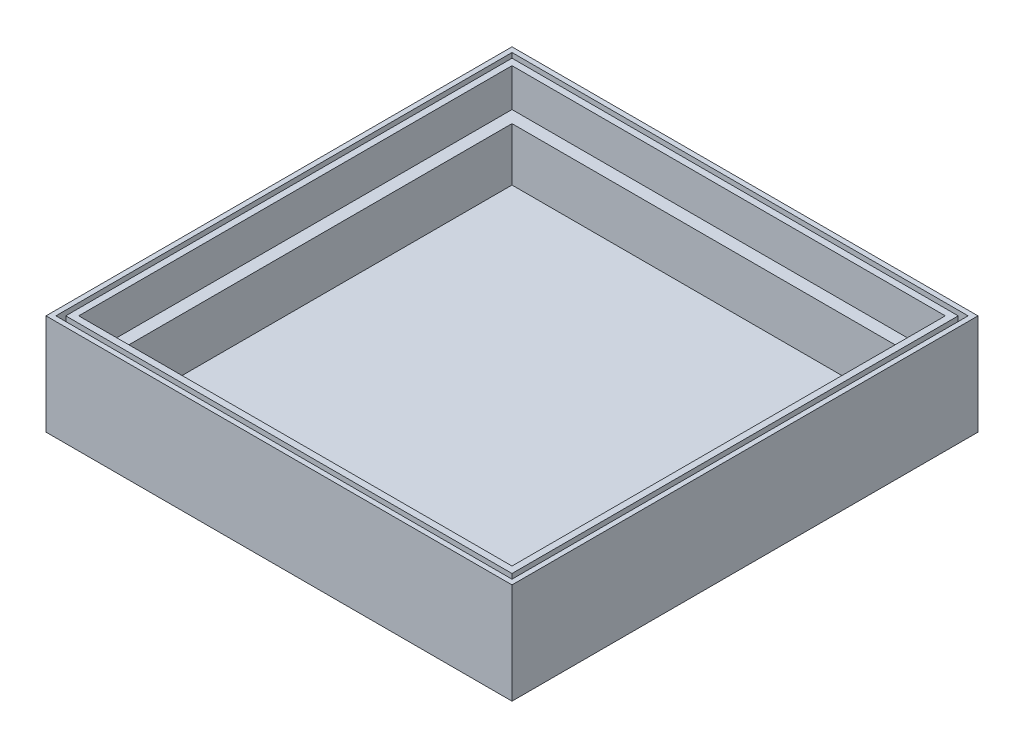
ISO-10303-21;
HEADER;
FILE_DESCRIPTION(('STEP AP214'),'2;1');
FILE_NAME('part.step','',(''),(''),'','','');
FILE_SCHEMA(('AUTOMOTIVE_DESIGN { 1 0 10303 214 1 1 1 1 }'));
ENDSEC;
DATA;
#1=APPLICATION_CONTEXT('core data for automotive mechanical design processes');
#2=APPLICATION_PROTOCOL_DEFINITION('international standard','automotive_design',2000,#1);
#3=PRODUCT_CONTEXT('',#1,'mechanical');
#4=PRODUCT('Part','Part','',(#3));
#5=PRODUCT_RELATED_PRODUCT_CATEGORY('part','',(#4));
#6=PRODUCT_DEFINITION_FORMATION('','',#4);
#7=PRODUCT_DEFINITION_CONTEXT('part definition',#1,'design');
#8=PRODUCT_DEFINITION('design','',#6,#7);
#9=PRODUCT_DEFINITION_SHAPE('','',#8);
#10=(LENGTH_UNIT() NAMED_UNIT(*) SI_UNIT(.MILLI.,.METRE.));
#11=(NAMED_UNIT(*) PLANE_ANGLE_UNIT() SI_UNIT($,.RADIAN.));
#12=(NAMED_UNIT(*) SI_UNIT($,.STERADIAN.) SOLID_ANGLE_UNIT());
#13=UNCERTAINTY_MEASURE_WITH_UNIT(LENGTH_MEASURE(1.E-05),#10,'distance_accuracy_value','');
#14=(GEOMETRIC_REPRESENTATION_CONTEXT(3) GLOBAL_UNCERTAINTY_ASSIGNED_CONTEXT((#13)) GLOBAL_UNIT_ASSIGNED_CONTEXT((#10,
#11,#12)) REPRESENTATION_CONTEXT('',''));
#15=CARTESIAN_POINT('',(0.,0.,0.));
#16=DIRECTION('',(0.,0.,1.));
#17=DIRECTION('',(1.,0.,0.));
#18=AXIS2_PLACEMENT_3D('',#15,#16,#17);
#19=CARTESIAN_POINT('',(0.,67.31,0.));
#20=DIRECTION('',(0.,-1.,0.));
#21=DIRECTION('',(0.,0.,-1.));
#22=AXIS2_PLACEMENT_3D('',#19,#20,#21);
#23=PLANE('',#22);
#24=DIRECTION('',(1.,0.,0.));
#25=VECTOR('',#24,1.);
#26=CARTESIAN_POINT('',(-144.78,67.31,144.78));
#27=LINE('',#26,#25);
#28=CARTESIAN_POINT('',(-144.78,67.31,144.78));
#29=VERTEX_POINT('',#28);
#30=CARTESIAN_POINT('',(144.78,67.31,144.78));
#31=VERTEX_POINT('',#30);
#32=EDGE_CURVE('E279',#29,#31,#27,.T.);
#33=ORIENTED_EDGE('',*,*,#32,.F.);
#34=DIRECTION('',(0.,0.,1.));
#35=VECTOR('',#34,1.);
#36=CARTESIAN_POINT('',(-144.78,67.31,-144.78));
#37=LINE('',#36,#35);
#38=CARTESIAN_POINT('',(-144.78,67.31,-144.78));
#39=VERTEX_POINT('',#38);
#40=EDGE_CURVE('E256',#39,#29,#37,.T.);
#41=ORIENTED_EDGE('',*,*,#40,.F.);
#42=DIRECTION('',(-1.,0.,0.));
#43=VECTOR('',#42,1.);
#44=CARTESIAN_POINT('',(-144.78,67.31,-144.78));
#45=LINE('',#44,#43);
#46=CARTESIAN_POINT('',(144.78,67.31,-144.78));
#47=VERTEX_POINT('',#46);
#48=EDGE_CURVE('E268',#47,#39,#45,.T.);
#49=ORIENTED_EDGE('',*,*,#48,.F.);
#50=DIRECTION('',(0.,0.,-1.));
#51=VECTOR('',#50,1.);
#52=CARTESIAN_POINT('',(144.78,67.31,-144.78));
#53=LINE('',#52,#51);
#54=EDGE_CURVE('E282',#31,#47,#53,.T.);
#55=ORIENTED_EDGE('',*,*,#54,.F.);
#56=EDGE_LOOP('',(#33,#41,#49,#55));
#57=FACE_BOUND('',#56,.T.);
#58=DIRECTION('',(0.,0.,1.));
#59=VECTOR('',#58,1.);
#60=CARTESIAN_POINT('',(-149.098,67.31,-149.098));
#61=LINE('',#60,#59);
#62=CARTESIAN_POINT('',(-149.098,67.31,-149.098));
#63=VERTEX_POINT('',#62);
#64=CARTESIAN_POINT('',(-149.098,67.31,149.098));
#65=VERTEX_POINT('',#64);
#66=EDGE_CURVE('E202',#63,#65,#61,.T.);
#67=ORIENTED_EDGE('',*,*,#66,.T.);
#68=DIRECTION('',(1.,0.,0.));
#69=VECTOR('',#68,1.);
#70=CARTESIAN_POINT('',(-149.098,67.31,149.098));
#71=LINE('',#70,#69);
#72=CARTESIAN_POINT('',(149.098,67.31,149.098));
#73=VERTEX_POINT('',#72);
#74=EDGE_CURVE('E175',#65,#73,#71,.T.);
#75=ORIENTED_EDGE('',*,*,#74,.T.);
#76=DIRECTION('',(0.,0.,-1.));
#77=VECTOR('',#76,1.);
#78=CARTESIAN_POINT('',(149.098,67.31,-149.098));
#79=LINE('',#78,#77);
#80=CARTESIAN_POINT('',(149.098,67.31,-149.098));
#81=VERTEX_POINT('',#80);
#82=EDGE_CURVE('E55',#73,#81,#79,.T.);
#83=ORIENTED_EDGE('',*,*,#82,.T.);
#84=DIRECTION('',(-1.,0.,0.));
#85=VECTOR('',#84,1.);
#86=CARTESIAN_POINT('',(-149.098,67.31,-149.098));
#87=LINE('',#86,#85);
#88=EDGE_CURVE('E195',#81,#63,#87,.T.);
#89=ORIENTED_EDGE('',*,*,#88,.T.);
#90=EDGE_LOOP('',(#67,#75,#83,#89));
#91=FACE_BOUND('',#90,.T.);
#92=ADVANCED_FACE('F32',(#57,#91),#23,.F.);
#93=CARTESIAN_POINT('',(-144.78,41.91,-144.78));
#94=DIRECTION('',(-1.,0.,0.));
#95=DIRECTION('',(0.,0.,1.));
#96=AXIS2_PLACEMENT_3D('',#93,#94,#95);
#97=PLANE('',#96);
#98=ORIENTED_EDGE('',*,*,#40,.T.);
#99=DIRECTION('',(0.,1.,0.));
#100=VECTOR('',#99,1.);
#101=CARTESIAN_POINT('',(-144.78,41.91,144.78));
#102=LINE('',#101,#100);
#103=CARTESIAN_POINT('',(-144.78,41.91,144.78));
#104=VERTEX_POINT('',#103);
#105=EDGE_CURVE('E277',#104,#29,#102,.T.);
#106=ORIENTED_EDGE('',*,*,#105,.F.);
#107=DIRECTION('',(0.,0.,1.));
#108=VECTOR('',#107,1.);
#109=CARTESIAN_POINT('',(-144.78,41.91,-144.78));
#110=LINE('',#109,#108);
#111=CARTESIAN_POINT('',(-144.78,41.91,-144.78));
#112=VERTEX_POINT('',#111);
#113=EDGE_CURVE('E264',#112,#104,#110,.T.);
#114=ORIENTED_EDGE('',*,*,#113,.F.);
#115=DIRECTION('',(0.,1.,0.));
#116=VECTOR('',#115,1.);
#117=CARTESIAN_POINT('',(-144.78,41.91,-144.78));
#118=LINE('',#117,#116);
#119=EDGE_CURVE('E287',#112,#39,#118,.T.);
#120=ORIENTED_EDGE('',*,*,#119,.T.);
#121=EDGE_LOOP('',(#98,#106,#114,#120));
#122=FACE_BOUND('',#121,.T.);
#123=ADVANCED_FACE('F361',(#122),#97,.F.);
#124=CARTESIAN_POINT('',(-144.78,41.91,-144.78));
#125=DIRECTION('',(0.,0.,-1.));
#126=DIRECTION('',(-1.,0.,0.));
#127=AXIS2_PLACEMENT_3D('',#124,#125,#126);
#128=PLANE('',#127);
#129=ORIENTED_EDGE('',*,*,#48,.T.);
#130=ORIENTED_EDGE('',*,*,#119,.F.);
#131=DIRECTION('',(-1.,0.,0.));
#132=VECTOR('',#131,1.);
#133=CARTESIAN_POINT('',(-144.78,41.91,-144.78));
#134=LINE('',#133,#132);
#135=CARTESIAN_POINT('',(144.78,41.91,-144.78));
#136=VERTEX_POINT('',#135);
#137=EDGE_CURVE('E274',#136,#112,#134,.T.);
#138=ORIENTED_EDGE('',*,*,#137,.F.);
#139=DIRECTION('',(0.,1.,0.));
#140=VECTOR('',#139,1.);
#141=CARTESIAN_POINT('',(144.78,41.91,-144.78));
#142=LINE('',#141,#140);
#143=EDGE_CURVE('E290',#136,#47,#142,.T.);
#144=ORIENTED_EDGE('',*,*,#143,.T.);
#145=EDGE_LOOP('',(#129,#130,#138,#144));
#146=FACE_BOUND('',#145,.T.);
#147=ADVANCED_FACE('F368',(#146),#128,.F.);
#148=CARTESIAN_POINT('',(144.78,41.91,-144.78));
#149=DIRECTION('',(1.,0.,0.));
#150=DIRECTION('',(0.,0.,-1.));
#151=AXIS2_PLACEMENT_3D('',#148,#149,#150);
#152=PLANE('',#151);
#153=ORIENTED_EDGE('',*,*,#54,.T.);
#154=ORIENTED_EDGE('',*,*,#143,.F.);
#155=DIRECTION('',(0.,0.,-1.));
#156=VECTOR('',#155,1.);
#157=CARTESIAN_POINT('',(144.78,41.91,-144.78));
#158=LINE('',#157,#156);
#159=CARTESIAN_POINT('',(144.78,41.91,144.78));
#160=VERTEX_POINT('',#159);
#161=EDGE_CURVE('E271',#160,#136,#158,.T.);
#162=ORIENTED_EDGE('',*,*,#161,.F.);
#163=DIRECTION('',(0.,1.,0.));
#164=VECTOR('',#163,1.);
#165=CARTESIAN_POINT('',(144.78,41.91,144.78));
#166=LINE('',#165,#164);
#167=EDGE_CURVE('E292',#160,#31,#166,.T.);
#168=ORIENTED_EDGE('',*,*,#167,.T.);
#169=EDGE_LOOP('',(#153,#154,#162,#168));
#170=FACE_BOUND('',#169,.T.);
#171=ADVANCED_FACE('F456',(#170),#152,.F.);
#172=CARTESIAN_POINT('',(-144.78,41.91,144.78));
#173=DIRECTION('',(0.,0.,1.));
#174=DIRECTION('',(1.,0.,0.));
#175=AXIS2_PLACEMENT_3D('',#172,#173,#174);
#176=PLANE('',#175);
#177=ORIENTED_EDGE('',*,*,#32,.T.);
#178=ORIENTED_EDGE('',*,*,#167,.F.);
#179=DIRECTION('',(1.,0.,0.));
#180=VECTOR('',#179,1.);
#181=CARTESIAN_POINT('',(-144.78,41.91,144.78));
#182=LINE('',#181,#180);
#183=EDGE_CURVE('E267',#104,#160,#182,.T.);
#184=ORIENTED_EDGE('',*,*,#183,.F.);
#185=ORIENTED_EDGE('',*,*,#105,.T.);
#186=EDGE_LOOP('',(#177,#178,#184,#185));
#187=FACE_BOUND('',#186,.T.);
#188=ADVANCED_FACE('F465',(#187),#176,.F.);
#189=CARTESIAN_POINT('',(0.,41.91,0.));
#190=DIRECTION('',(0.,1.,0.));
#191=DIRECTION('',(0.,0.,1.));
#192=AXIS2_PLACEMENT_3D('',#189,#190,#191);
#193=PLANE('',#192);
#194=DIRECTION('',(0.,0.,1.));
#195=VECTOR('',#194,1.);
#196=CARTESIAN_POINT('',(-136.652,41.91,0.));
#197=LINE('',#196,#195);
#198=CARTESIAN_POINT('',(-136.652,41.91,-136.652));
#199=VERTEX_POINT('',#198);
#200=CARTESIAN_POINT('',(-136.652,41.91,136.652));
#201=VERTEX_POINT('',#200);
#202=EDGE_CURVE('E11',#199,#201,#197,.T.);
#203=ORIENTED_EDGE('',*,*,#202,.F.);
#204=DIRECTION('',(-1.,0.,0.));
#205=VECTOR('',#204,1.);
#206=CARTESIAN_POINT('',(0.,41.91,-136.652));
#207=LINE('',#206,#205);
#208=CARTESIAN_POINT('',(136.652,41.91,-136.652));
#209=VERTEX_POINT('',#208);
#210=EDGE_CURVE('E40',#209,#199,#207,.T.);
#211=ORIENTED_EDGE('',*,*,#210,.F.);
#212=DIRECTION('',(0.,0.,-1.));
#213=VECTOR('',#212,1.);
#214=CARTESIAN_POINT('',(136.652,41.91,0.));
#215=LINE('',#214,#213);
#216=CARTESIAN_POINT('',(136.652,41.91,136.652));
#217=VERTEX_POINT('',#216);
#218=EDGE_CURVE('E327',#217,#209,#215,.T.);
#219=ORIENTED_EDGE('',*,*,#218,.F.);
#220=DIRECTION('',(1.,0.,0.));
#221=VECTOR('',#220,1.);
#222=CARTESIAN_POINT('',(0.,41.91,136.652));
#223=LINE('',#222,#221);
#224=EDGE_CURVE('E319',#201,#217,#223,.T.);
#225=ORIENTED_EDGE('',*,*,#224,.F.);
#226=EDGE_LOOP('',(#203,#211,#219,#225));
#227=FACE_BOUND('',#226,.T.);
#228=ORIENTED_EDGE('',*,*,#113,.T.);
#229=ORIENTED_EDGE('',*,*,#183,.T.);
#230=ORIENTED_EDGE('',*,*,#161,.T.);
#231=ORIENTED_EDGE('',*,*,#137,.T.);
#232=EDGE_LOOP('',(#228,#229,#230,#231));
#233=FACE_BOUND('',#232,.T.);
#234=ADVANCED_FACE('F339',(#227,#233),#193,.T.);
#235=CARTESIAN_POINT('',(-136.652,6.35,136.652));
#236=DIRECTION('',(-1.,0.,0.));
#237=DIRECTION('',(0.,0.,1.));
#238=AXIS2_PLACEMENT_3D('',#235,#236,#237);
#239=PLANE('',#238);
#240=ORIENTED_EDGE('',*,*,#202,.T.);
#241=DIRECTION('',(0.,1.,0.));
#242=VECTOR('',#241,1.);
#243=CARTESIAN_POINT('',(-136.652,6.35,136.652));
#244=LINE('',#243,#242);
#245=CARTESIAN_POINT('',(-136.652,6.35,136.652));
#246=VERTEX_POINT('',#245);
#247=EDGE_CURVE('E252',#246,#201,#244,.T.);
#248=ORIENTED_EDGE('',*,*,#247,.F.);
#249=DIRECTION('',(0.,0.,1.));
#250=VECTOR('',#249,1.);
#251=CARTESIAN_POINT('',(-136.652,6.35,136.652));
#252=LINE('',#251,#250);
#253=CARTESIAN_POINT('',(-136.652,6.35,-136.652));
#254=VERTEX_POINT('',#253);
#255=EDGE_CURVE('E235',#254,#246,#252,.T.);
#256=ORIENTED_EDGE('',*,*,#255,.F.);
#257=DIRECTION('',(0.,1.,0.));
#258=VECTOR('',#257,1.);
#259=CARTESIAN_POINT('',(-136.652,6.35,-136.652));
#260=LINE('',#259,#258);
#261=EDGE_CURVE('E253',#254,#199,#260,.T.);
#262=ORIENTED_EDGE('',*,*,#261,.T.);
#263=EDGE_LOOP('',(#240,#248,#256,#262));
#264=FACE_BOUND('',#263,.T.);
#265=ADVANCED_FACE('F337',(#264),#239,.F.);
#266=CARTESIAN_POINT('',(-136.652,6.35,-136.652));
#267=DIRECTION('',(0.,0.,-1.));
#268=DIRECTION('',(-1.,0.,0.));
#269=AXIS2_PLACEMENT_3D('',#266,#267,#268);
#270=PLANE('',#269);
#271=ORIENTED_EDGE('',*,*,#210,.T.);
#272=ORIENTED_EDGE('',*,*,#261,.F.);
#273=DIRECTION('',(-1.,0.,0.));
#274=VECTOR('',#273,1.);
#275=CARTESIAN_POINT('',(-136.652,6.35,-136.652));
#276=LINE('',#275,#274);
#277=CARTESIAN_POINT('',(136.652,6.35,-136.652));
#278=VERTEX_POINT('',#277);
#279=EDGE_CURVE('E249',#278,#254,#276,.T.);
#280=ORIENTED_EDGE('',*,*,#279,.F.);
#281=DIRECTION('',(0.,1.,0.));
#282=VECTOR('',#281,1.);
#283=CARTESIAN_POINT('',(136.652,6.35,-136.652));
#284=LINE('',#283,#282);
#285=EDGE_CURVE('E257',#278,#209,#284,.T.);
#286=ORIENTED_EDGE('',*,*,#285,.T.);
#287=EDGE_LOOP('',(#271,#272,#280,#286));
#288=FACE_BOUND('',#287,.T.);
#289=ADVANCED_FACE('F330',(#288),#270,.F.);
#290=CARTESIAN_POINT('',(136.652,6.35,136.652));
#291=DIRECTION('',(1.,0.,0.));
#292=DIRECTION('',(0.,0.,-1.));
#293=AXIS2_PLACEMENT_3D('',#290,#291,#292);
#294=PLANE('',#293);
#295=ORIENTED_EDGE('',*,*,#218,.T.);
#296=ORIENTED_EDGE('',*,*,#285,.F.);
#297=DIRECTION('',(0.,0.,-1.));
#298=VECTOR('',#297,1.);
#299=CARTESIAN_POINT('',(136.652,6.35,136.652));
#300=LINE('',#299,#298);
#301=CARTESIAN_POINT('',(136.652,6.35,136.652));
#302=VERTEX_POINT('',#301);
#303=EDGE_CURVE('E246',#302,#278,#300,.T.);
#304=ORIENTED_EDGE('',*,*,#303,.F.);
#305=DIRECTION('',(0.,1.,0.));
#306=VECTOR('',#305,1.);
#307=CARTESIAN_POINT('',(136.652,6.35,136.652));
#308=LINE('',#307,#306);
#309=EDGE_CURVE('E260',#302,#217,#308,.T.);
#310=ORIENTED_EDGE('',*,*,#309,.T.);
#311=EDGE_LOOP('',(#295,#296,#304,#310));
#312=FACE_BOUND('',#311,.T.);
#313=ADVANCED_FACE('F346',(#312),#294,.F.);
#314=CARTESIAN_POINT('',(-136.652,6.35,136.652));
#315=DIRECTION('',(0.,0.,1.));
#316=DIRECTION('',(1.,0.,0.));
#317=AXIS2_PLACEMENT_3D('',#314,#315,#316);
#318=PLANE('',#317);
#319=ORIENTED_EDGE('',*,*,#224,.T.);
#320=ORIENTED_EDGE('',*,*,#309,.F.);
#321=DIRECTION('',(1.,0.,0.));
#322=VECTOR('',#321,1.);
#323=CARTESIAN_POINT('',(-136.652,6.35,136.652));
#324=LINE('',#323,#322);
#325=EDGE_CURVE('E243',#246,#302,#324,.T.);
#326=ORIENTED_EDGE('',*,*,#325,.F.);
#327=ORIENTED_EDGE('',*,*,#247,.T.);
#328=EDGE_LOOP('',(#319,#320,#326,#327));
#329=FACE_BOUND('',#328,.T.);
#330=ADVANCED_FACE('F342',(#329),#318,.F.);
#331=CARTESIAN_POINT('',(0.,6.35,0.));
#332=DIRECTION('',(0.,-1.,0.));
#333=DIRECTION('',(0.,0.,-1.));
#334=AXIS2_PLACEMENT_3D('',#331,#332,#333);
#335=PLANE('',#334);
#336=ORIENTED_EDGE('',*,*,#255,.T.);
#337=ORIENTED_EDGE('',*,*,#325,.T.);
#338=ORIENTED_EDGE('',*,*,#303,.T.);
#339=ORIENTED_EDGE('',*,*,#279,.T.);
#340=EDGE_LOOP('',(#336,#337,#338,#339));
#341=FACE_BOUND('',#340,.T.);
#342=ADVANCED_FACE('F348',(#341),#335,.F.);
#343=CARTESIAN_POINT('',(-152.4,54.61,-152.4));
#344=DIRECTION('',(-1.,0.,0.));
#345=DIRECTION('',(0.,0.,1.));
#346=AXIS2_PLACEMENT_3D('',#343,#344,#345);
#347=PLANE('',#346);
#348=DIRECTION('',(0.,0.,1.));
#349=VECTOR('',#348,1.);
#350=CARTESIAN_POINT('',(-152.4,67.31,-152.4));
#351=LINE('',#350,#349);
#352=CARTESIAN_POINT('',(-152.4,67.31,-152.4));
#353=VERTEX_POINT('',#352);
#354=CARTESIAN_POINT('',(-152.4,67.31,152.4));
#355=VERTEX_POINT('',#354);
#356=EDGE_CURVE('E47',#353,#355,#351,.T.);
#357=ORIENTED_EDGE('',*,*,#356,.T.);
#358=DIRECTION('',(0.,1.,0.));
#359=VECTOR('',#358,1.);
#360=CARTESIAN_POINT('',(-152.4,54.61,152.4));
#361=LINE('',#360,#359);
#362=CARTESIAN_POINT('',(-152.4,54.61,152.4));
#363=VERTEX_POINT('',#362);
#364=EDGE_CURVE('E223',#363,#355,#361,.T.);
#365=ORIENTED_EDGE('',*,*,#364,.F.);
#366=DIRECTION('',(0.,0.,1.));
#367=VECTOR('',#366,1.);
#368=CARTESIAN_POINT('',(-152.4,54.61,-152.4));
#369=LINE('',#368,#367);
#370=CARTESIAN_POINT('',(-152.4,54.61,-152.4));
#371=VERTEX_POINT('',#370);
#372=EDGE_CURVE('E210',#371,#363,#369,.T.);
#373=ORIENTED_EDGE('',*,*,#372,.F.);
#374=DIRECTION('',(0.,1.,0.));
#375=VECTOR('',#374,1.);
#376=CARTESIAN_POINT('',(-152.4,54.61,-152.4));
#377=LINE('',#376,#375);
#378=EDGE_CURVE('E233',#371,#353,#377,.T.);
#379=ORIENTED_EDGE('',*,*,#378,.T.);
#380=EDGE_LOOP('',(#357,#365,#373,#379));
#381=FACE_BOUND('',#380,.T.);
#382=ADVANCED_FACE('F350',(#381),#347,.F.);
#383=CARTESIAN_POINT('',(-152.4,54.61,-152.4));
#384=DIRECTION('',(0.,0.,-1.));
#385=DIRECTION('',(-1.,0.,0.));
#386=AXIS2_PLACEMENT_3D('',#383,#384,#385);
#387=PLANE('',#386);
#388=DIRECTION('',(-1.,0.,0.));
#389=VECTOR('',#388,1.);
#390=CARTESIAN_POINT('',(-152.4,67.31,-152.4));
#391=LINE('',#390,#389);
#392=CARTESIAN_POINT('',(152.4,67.31,-152.4));
#393=VERTEX_POINT('',#392);
#394=EDGE_CURVE('E214',#393,#353,#391,.T.);
#395=ORIENTED_EDGE('',*,*,#394,.T.);
#396=ORIENTED_EDGE('',*,*,#378,.F.);
#397=DIRECTION('',(-1.,0.,0.));
#398=VECTOR('',#397,1.);
#399=CARTESIAN_POINT('',(-152.4,54.61,-152.4));
#400=LINE('',#399,#398);
#401=CARTESIAN_POINT('',(152.4,54.61,-152.4));
#402=VERTEX_POINT('',#401);
#403=EDGE_CURVE('E220',#402,#371,#400,.T.);
#404=ORIENTED_EDGE('',*,*,#403,.F.);
#405=DIRECTION('',(0.,1.,0.));
#406=VECTOR('',#405,1.);
#407=CARTESIAN_POINT('',(152.4,54.61,-152.4));
#408=LINE('',#407,#406);
#409=EDGE_CURVE('E236',#402,#393,#408,.T.);
#410=ORIENTED_EDGE('',*,*,#409,.T.);
#411=EDGE_LOOP('',(#395,#396,#404,#410));
#412=FACE_BOUND('',#411,.T.);
#413=ADVANCED_FACE('F356',(#412),#387,.F.);
#414=CARTESIAN_POINT('',(152.4,54.61,-152.4));
#415=DIRECTION('',(1.,0.,0.));
#416=DIRECTION('',(0.,0.,-1.));
#417=AXIS2_PLACEMENT_3D('',#414,#415,#416);
#418=PLANE('',#417);
#419=DIRECTION('',(0.,0.,-1.));
#420=VECTOR('',#419,1.);
#421=CARTESIAN_POINT('',(152.4,67.31,-152.4));
#422=LINE('',#421,#420);
#423=CARTESIAN_POINT('',(152.4,67.31,152.4));
#424=VERTEX_POINT('',#423);
#425=EDGE_CURVE('E228',#424,#393,#422,.T.);
#426=ORIENTED_EDGE('',*,*,#425,.T.);
#427=ORIENTED_EDGE('',*,*,#409,.F.);
#428=DIRECTION('',(0.,0.,-1.));
#429=VECTOR('',#428,1.);
#430=CARTESIAN_POINT('',(152.4,54.61,-152.4));
#431=LINE('',#430,#429);
#432=CARTESIAN_POINT('',(152.4,54.61,152.4));
#433=VERTEX_POINT('',#432);
#434=EDGE_CURVE('E217',#433,#402,#431,.T.);
#435=ORIENTED_EDGE('',*,*,#434,.F.);
#436=DIRECTION('',(0.,1.,0.));
#437=VECTOR('',#436,1.);
#438=CARTESIAN_POINT('',(152.4,54.61,152.4));
#439=LINE('',#438,#437);
#440=EDGE_CURVE('E238',#433,#424,#439,.T.);
#441=ORIENTED_EDGE('',*,*,#440,.T.);
#442=EDGE_LOOP('',(#426,#427,#435,#441));
#443=FACE_BOUND('',#442,.T.);
#444=ADVANCED_FACE('F527',(#443),#418,.F.);
#445=CARTESIAN_POINT('',(-152.4,54.61,152.4));
#446=DIRECTION('',(0.,0.,1.));
#447=DIRECTION('',(1.,0.,0.));
#448=AXIS2_PLACEMENT_3D('',#445,#446,#447);
#449=PLANE('',#448);
#450=DIRECTION('',(1.,0.,0.));
#451=VECTOR('',#450,1.);
#452=CARTESIAN_POINT('',(-152.4,67.31,152.4));
#453=LINE('',#452,#451);
#454=EDGE_CURVE('E225',#355,#424,#453,.T.);
#455=ORIENTED_EDGE('',*,*,#454,.T.);
#456=ORIENTED_EDGE('',*,*,#440,.F.);
#457=DIRECTION('',(1.,0.,0.));
#458=VECTOR('',#457,1.);
#459=CARTESIAN_POINT('',(-152.4,54.61,152.4));
#460=LINE('',#459,#458);
#461=EDGE_CURVE('E213',#363,#433,#460,.T.);
#462=ORIENTED_EDGE('',*,*,#461,.F.);
#463=ORIENTED_EDGE('',*,*,#364,.T.);
#464=EDGE_LOOP('',(#455,#456,#462,#463));
#465=FACE_BOUND('',#464,.T.);
#466=ADVANCED_FACE('F536',(#465),#449,.F.);
#467=CARTESIAN_POINT('',(0.,54.61,0.));
#468=DIRECTION('',(0.,1.,0.));
#469=DIRECTION('',(0.,0.,1.));
#470=AXIS2_PLACEMENT_3D('',#467,#468,#469);
#471=PLANE('',#470);
#472=DIRECTION('',(-1.,0.,0.));
#473=VECTOR('',#472,1.);
#474=CARTESIAN_POINT('',(-149.098,54.61,-149.098));
#475=LINE('',#474,#473);
#476=CARTESIAN_POINT('',(149.098,54.61,-149.098));
#477=VERTEX_POINT('',#476);
#478=CARTESIAN_POINT('',(-149.098,54.61,-149.098));
#479=VERTEX_POINT('',#478);
#480=EDGE_CURVE('E181',#477,#479,#475,.T.);
#481=ORIENTED_EDGE('',*,*,#480,.F.);
#482=DIRECTION('',(0.,0.,-1.));
#483=VECTOR('',#482,1.);
#484=CARTESIAN_POINT('',(149.098,54.61,-149.098));
#485=LINE('',#484,#483);
#486=CARTESIAN_POINT('',(149.098,54.61,149.098));
#487=VERTEX_POINT('',#486);
#488=EDGE_CURVE('E191',#487,#477,#485,.T.);
#489=ORIENTED_EDGE('',*,*,#488,.F.);
#490=DIRECTION('',(1.,0.,0.));
#491=VECTOR('',#490,1.);
#492=CARTESIAN_POINT('',(-149.098,54.61,149.098));
#493=LINE('',#492,#491);
#494=CARTESIAN_POINT('',(-149.098,54.61,149.098));
#495=VERTEX_POINT('',#494);
#496=EDGE_CURVE('E173',#495,#487,#493,.T.);
#497=ORIENTED_EDGE('',*,*,#496,.F.);
#498=DIRECTION('',(0.,0.,1.));
#499=VECTOR('',#498,1.);
#500=CARTESIAN_POINT('',(-149.098,54.61,-149.098));
#501=LINE('',#500,#499);
#502=EDGE_CURVE('E188',#479,#495,#501,.T.);
#503=ORIENTED_EDGE('',*,*,#502,.F.);
#504=EDGE_LOOP('',(#481,#489,#497,#503));
#505=FACE_BOUND('',#504,.T.);
#506=ORIENTED_EDGE('',*,*,#372,.T.);
#507=ORIENTED_EDGE('',*,*,#461,.T.);
#508=ORIENTED_EDGE('',*,*,#434,.T.);
#509=ORIENTED_EDGE('',*,*,#403,.T.);
#510=EDGE_LOOP('',(#506,#507,#508,#509));
#511=FACE_BOUND('',#510,.T.);
#512=ADVANCED_FACE('F186',(#505,#511),#471,.T.);
#513=CARTESIAN_POINT('',(-149.098,54.61,-149.098));
#514=DIRECTION('',(-1.,0.,0.));
#515=DIRECTION('',(0.,0.,1.));
#516=AXIS2_PLACEMENT_3D('',#513,#514,#515);
#517=PLANE('',#516);
#518=ORIENTED_EDGE('',*,*,#66,.F.);
#519=DIRECTION('',(0.,1.,0.));
#520=VECTOR('',#519,1.);
#521=CARTESIAN_POINT('',(-149.098,54.61,-149.098));
#522=LINE('',#521,#520);
#523=EDGE_CURVE('E194',#479,#63,#522,.T.);
#524=ORIENTED_EDGE('',*,*,#523,.F.);
#525=ORIENTED_EDGE('',*,*,#502,.T.);
#526=DIRECTION('',(0.,1.,0.));
#527=VECTOR('',#526,1.);
#528=CARTESIAN_POINT('',(-149.098,54.61,149.098));
#529=LINE('',#528,#527);
#530=EDGE_CURVE('E170',#495,#65,#529,.T.);
#531=ORIENTED_EDGE('',*,*,#530,.T.);
#532=EDGE_LOOP('',(#518,#524,#525,#531));
#533=FACE_BOUND('',#532,.T.);
#534=ADVANCED_FACE('F193',(#533),#517,.T.);
#535=CARTESIAN_POINT('',(-149.098,54.61,-149.098));
#536=DIRECTION('',(0.,0.,-1.));
#537=DIRECTION('',(-1.,0.,0.));
#538=AXIS2_PLACEMENT_3D('',#535,#536,#537);
#539=PLANE('',#538);
#540=ORIENTED_EDGE('',*,*,#88,.F.);
#541=DIRECTION('',(0.,1.,0.));
#542=VECTOR('',#541,1.);
#543=CARTESIAN_POINT('',(149.098,54.61,-149.098));
#544=LINE('',#543,#542);
#545=EDGE_CURVE('E207',#477,#81,#544,.T.);
#546=ORIENTED_EDGE('',*,*,#545,.F.);
#547=ORIENTED_EDGE('',*,*,#480,.T.);
#548=ORIENTED_EDGE('',*,*,#523,.T.);
#549=EDGE_LOOP('',(#540,#546,#547,#548));
#550=FACE_BOUND('',#549,.T.);
#551=ADVANCED_FACE('F560',(#550),#539,.T.);
#552=CARTESIAN_POINT('',(149.098,54.61,-149.098));
#553=DIRECTION('',(1.,0.,0.));
#554=DIRECTION('',(0.,0.,-1.));
#555=AXIS2_PLACEMENT_3D('',#552,#553,#554);
#556=PLANE('',#555);
#557=ORIENTED_EDGE('',*,*,#82,.F.);
#558=DIRECTION('',(0.,1.,0.));
#559=VECTOR('',#558,1.);
#560=CARTESIAN_POINT('',(149.098,54.61,149.098));
#561=LINE('',#560,#559);
#562=EDGE_CURVE('E180',#487,#73,#561,.T.);
#563=ORIENTED_EDGE('',*,*,#562,.F.);
#564=ORIENTED_EDGE('',*,*,#488,.T.);
#565=ORIENTED_EDGE('',*,*,#545,.T.);
#566=EDGE_LOOP('',(#557,#563,#564,#565));
#567=FACE_BOUND('',#566,.T.);
#568=ADVANCED_FACE('F406',(#567),#556,.T.);
#569=CARTESIAN_POINT('',(-149.098,54.61,149.098));
#570=DIRECTION('',(0.,0.,1.));
#571=DIRECTION('',(1.,0.,0.));
#572=AXIS2_PLACEMENT_3D('',#569,#570,#571);
#573=PLANE('',#572);
#574=ORIENTED_EDGE('',*,*,#74,.F.);
#575=ORIENTED_EDGE('',*,*,#530,.F.);
#576=ORIENTED_EDGE('',*,*,#496,.T.);
#577=ORIENTED_EDGE('',*,*,#562,.T.);
#578=EDGE_LOOP('',(#574,#575,#576,#577));
#579=FACE_BOUND('',#578,.T.);
#580=ADVANCED_FACE('F172',(#579),#573,.T.);
#581=CARTESIAN_POINT('',(0.,0.,0.));
#582=DIRECTION('',(0.,-1.,0.));
#583=DIRECTION('',(0.,0.,-1.));
#584=AXIS2_PLACEMENT_3D('',#581,#582,#583);
#585=PLANE('',#584);
#586=DIRECTION('',(0.,0.,-1.));
#587=VECTOR('',#586,1.);
#588=CARTESIAN_POINT('',(-155.702,0.,155.702));
#589=LINE('',#588,#587);
#590=CARTESIAN_POINT('',(-155.702,0.,155.702));
#591=VERTEX_POINT('',#590);
#592=CARTESIAN_POINT('',(-155.702,0.,-155.702));
#593=VERTEX_POINT('',#592);
#594=EDGE_CURVE('E289',#591,#593,#589,.T.);
#595=ORIENTED_EDGE('',*,*,#594,.T.);
#596=DIRECTION('',(1.,0.,0.));
#597=VECTOR('',#596,1.);
#598=CARTESIAN_POINT('',(-155.702,0.,-155.702));
#599=LINE('',#598,#597);
#600=CARTESIAN_POINT('',(155.702,0.,-155.702));
#601=VERTEX_POINT('',#600);
#602=EDGE_CURVE('E310',#593,#601,#599,.T.);
#603=ORIENTED_EDGE('',*,*,#602,.T.);
#604=DIRECTION('',(0.,0.,-1.));
#605=VECTOR('',#604,1.);
#606=CARTESIAN_POINT('',(155.702,0.,155.702));
#607=LINE('',#606,#605);
#608=CARTESIAN_POINT('',(155.702,0.,155.702));
#609=VERTEX_POINT('',#608);
#610=EDGE_CURVE('E313',#609,#601,#607,.T.);
#611=ORIENTED_EDGE('',*,*,#610,.F.);
#612=DIRECTION('',(1.,0.,0.));
#613=VECTOR('',#612,1.);
#614=CARTESIAN_POINT('',(-155.702,0.,155.702));
#615=LINE('',#614,#613);
#616=EDGE_CURVE('E300',#591,#609,#615,.T.);
#617=ORIENTED_EDGE('',*,*,#616,.F.);
#618=EDGE_LOOP('',(#595,#603,#611,#617));
#619=FACE_BOUND('',#618,.T.);
#620=ADVANCED_FACE('F400',(#619),#585,.T.);
#621=CARTESIAN_POINT('',(-155.702,67.31,-155.702));
#622=DIRECTION('',(0.,0.,-1.));
#623=DIRECTION('',(-1.,0.,0.));
#624=AXIS2_PLACEMENT_3D('',#621,#622,#623);
#625=PLANE('',#624);
#626=ORIENTED_EDGE('',*,*,#602,.F.);
#627=DIRECTION('',(0.,-1.,0.));
#628=VECTOR('',#627,1.);
#629=CARTESIAN_POINT('',(-155.702,67.31,-155.702));
#630=LINE('',#629,#628);
#631=CARTESIAN_POINT('',(-155.702,67.31,-155.702));
#632=VERTEX_POINT('',#631);
#633=EDGE_CURVE('E307',#632,#593,#630,.T.);
#634=ORIENTED_EDGE('',*,*,#633,.F.);
#635=DIRECTION('',(1.,0.,0.));
#636=VECTOR('',#635,1.);
#637=CARTESIAN_POINT('',(-155.702,67.31,-155.702));
#638=LINE('',#637,#636);
#639=CARTESIAN_POINT('',(155.702,67.31,-155.702));
#640=VERTEX_POINT('',#639);
#641=EDGE_CURVE('E299',#632,#640,#638,.T.);
#642=ORIENTED_EDGE('',*,*,#641,.T.);
#643=DIRECTION('',(0.,-1.,0.));
#644=VECTOR('',#643,1.);
#645=CARTESIAN_POINT('',(155.702,67.31,-155.702));
#646=LINE('',#645,#644);
#647=EDGE_CURVE('E323',#640,#601,#646,.T.);
#648=ORIENTED_EDGE('',*,*,#647,.T.);
#649=EDGE_LOOP('',(#626,#634,#642,#648));
#650=FACE_BOUND('',#649,.T.);
#651=ADVANCED_FACE('F398',(#650),#625,.T.);
#652=CARTESIAN_POINT('',(155.702,67.31,155.702));
#653=DIRECTION('',(-1.,0.,0.));
#654=DIRECTION('',(0.,0.,1.));
#655=AXIS2_PLACEMENT_3D('',#652,#653,#654);
#656=PLANE('',#655);
#657=ORIENTED_EDGE('',*,*,#610,.T.);
#658=ORIENTED_EDGE('',*,*,#647,.F.);
#659=DIRECTION('',(0.,0.,-1.));
#660=VECTOR('',#659,1.);
#661=CARTESIAN_POINT('',(155.702,67.31,155.702));
#662=LINE('',#661,#660);
#663=CARTESIAN_POINT('',(155.702,67.31,155.702));
#664=VERTEX_POINT('',#663);
#665=EDGE_CURVE('E303',#664,#640,#662,.T.);
#666=ORIENTED_EDGE('',*,*,#665,.F.);
#667=DIRECTION('',(0.,-1.,0.));
#668=VECTOR('',#667,1.);
#669=CARTESIAN_POINT('',(155.702,67.31,155.702));
#670=LINE('',#669,#668);
#671=EDGE_CURVE('E320',#664,#609,#670,.T.);
#672=ORIENTED_EDGE('',*,*,#671,.T.);
#673=EDGE_LOOP('',(#657,#658,#666,#672));
#674=FACE_BOUND('',#673,.T.);
#675=ADVANCED_FACE('F396',(#674),#656,.F.);
#676=CARTESIAN_POINT('',(-155.702,67.31,155.702));
#677=DIRECTION('',(0.,0.,-1.));
#678=DIRECTION('',(-1.,0.,0.));
#679=AXIS2_PLACEMENT_3D('',#676,#677,#678);
#680=PLANE('',#679);
#681=ORIENTED_EDGE('',*,*,#616,.T.);
#682=ORIENTED_EDGE('',*,*,#671,.F.);
#683=DIRECTION('',(1.,0.,0.));
#684=VECTOR('',#683,1.);
#685=CARTESIAN_POINT('',(-155.702,67.31,155.702));
#686=LINE('',#685,#684);
#687=CARTESIAN_POINT('',(-155.702,67.31,155.702));
#688=VERTEX_POINT('',#687);
#689=EDGE_CURVE('E305',#688,#664,#686,.T.);
#690=ORIENTED_EDGE('',*,*,#689,.F.);
#691=DIRECTION('',(0.,-1.,0.));
#692=VECTOR('',#691,1.);
#693=CARTESIAN_POINT('',(-155.702,67.31,155.702));
#694=LINE('',#693,#692);
#695=EDGE_CURVE('E317',#688,#591,#694,.T.);
#696=ORIENTED_EDGE('',*,*,#695,.T.);
#697=EDGE_LOOP('',(#681,#682,#690,#696));
#698=FACE_BOUND('',#697,.T.);
#699=ADVANCED_FACE('F379',(#698),#680,.F.);
#700=CARTESIAN_POINT('',(-155.702,67.31,155.702));
#701=DIRECTION('',(-1.,0.,0.));
#702=DIRECTION('',(0.,0.,1.));
#703=AXIS2_PLACEMENT_3D('',#700,#701,#702);
#704=PLANE('',#703);
#705=ORIENTED_EDGE('',*,*,#594,.F.);
#706=ORIENTED_EDGE('',*,*,#695,.F.);
#707=DIRECTION('',(0.,0.,-1.));
#708=VECTOR('',#707,1.);
#709=CARTESIAN_POINT('',(-155.702,67.31,155.702));
#710=LINE('',#709,#708);
#711=EDGE_CURVE('E296',#688,#632,#710,.T.);
#712=ORIENTED_EDGE('',*,*,#711,.T.);
#713=ORIENTED_EDGE('',*,*,#633,.T.);
#714=EDGE_LOOP('',(#705,#706,#712,#713));
#715=FACE_BOUND('',#714,.T.);
#716=ADVANCED_FACE('F34',(#715),#704,.T.);
#717=ORIENTED_EDGE('',*,*,#454,.F.);
#718=ORIENTED_EDGE('',*,*,#356,.F.);
#719=ORIENTED_EDGE('',*,*,#394,.F.);
#720=ORIENTED_EDGE('',*,*,#425,.F.);
#721=EDGE_LOOP('',(#717,#718,#719,#720));
#722=FACE_BOUND('',#721,.T.);
#723=ORIENTED_EDGE('',*,*,#711,.F.);
#724=ORIENTED_EDGE('',*,*,#689,.T.);
#725=ORIENTED_EDGE('',*,*,#665,.T.);
#726=ORIENTED_EDGE('',*,*,#641,.F.);
#727=EDGE_LOOP('',(#723,#724,#725,#726));
#728=FACE_BOUND('',#727,.T.);
#729=ADVANCED_FACE('F364',(#722,#728),#23,.F.);
#730=CLOSED_SHELL('',(#92,#123,#147,#171,#188,#234,#265,#289,#313,#330,#342,#382,#413,#444,#466,
#512,#534,#551,#568,#580,#620,#651,#675,#699,#716,#729));
#731=MANIFOLD_SOLID_BREP('B2',#730);
#732=ADVANCED_BREP_SHAPE_REPRESENTATION('',(#18,#731),#14);
#733=SHAPE_DEFINITION_REPRESENTATION(#9,#732);
ENDSEC;
END-ISO-10303-21;
